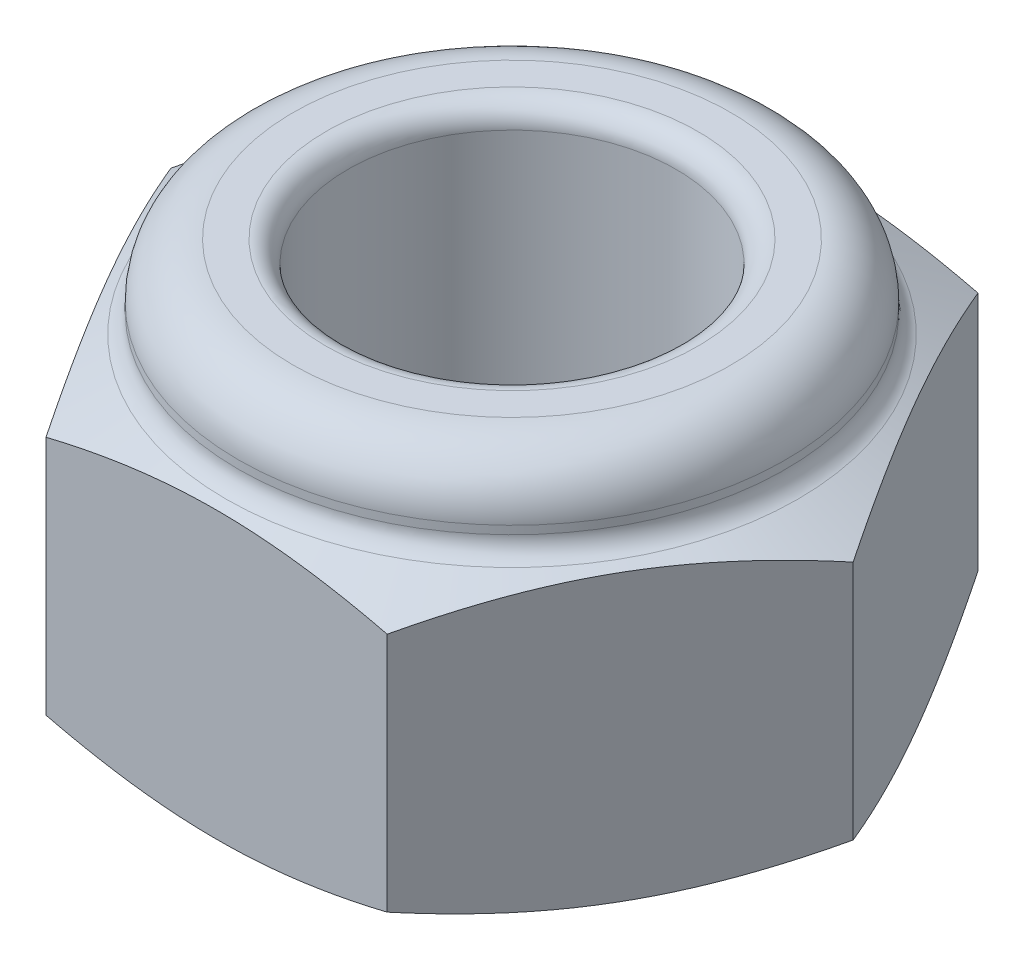
ISO-10303-21;
HEADER;
FILE_DESCRIPTION(('STEP AP214'),'2;1');
FILE_NAME('part.step','',(''),(''),'','','');
FILE_SCHEMA(('AUTOMOTIVE_DESIGN { 1 0 10303 214 1 1 1 1 }'));
ENDSEC;
DATA;
#1=APPLICATION_CONTEXT('core data for automotive mechanical design processes');
#2=APPLICATION_PROTOCOL_DEFINITION('international standard','automotive_design',2000,#1);
#3=PRODUCT_CONTEXT('',#1,'mechanical');
#4=PRODUCT('Part','Part','',(#3));
#5=PRODUCT_RELATED_PRODUCT_CATEGORY('part','',(#4));
#6=PRODUCT_DEFINITION_FORMATION('','',#4);
#7=PRODUCT_DEFINITION_CONTEXT('part definition',#1,'design');
#8=PRODUCT_DEFINITION('design','',#6,#7);
#9=PRODUCT_DEFINITION_SHAPE('','',#8);
#10=(LENGTH_UNIT() NAMED_UNIT(*) SI_UNIT(.MILLI.,.METRE.));
#11=(NAMED_UNIT(*) PLANE_ANGLE_UNIT() SI_UNIT($,.RADIAN.));
#12=(NAMED_UNIT(*) SI_UNIT($,.STERADIAN.) SOLID_ANGLE_UNIT());
#13=UNCERTAINTY_MEASURE_WITH_UNIT(LENGTH_MEASURE(1.E-05),#10,'distance_accuracy_value','');
#14=(GEOMETRIC_REPRESENTATION_CONTEXT(3) GLOBAL_UNCERTAINTY_ASSIGNED_CONTEXT((#13)) GLOBAL_UNIT_ASSIGNED_CONTEXT((#10,
#11,#12)) REPRESENTATION_CONTEXT('',''));
#15=CARTESIAN_POINT('',(0.,0.,0.));
#16=DIRECTION('',(0.,0.,1.));
#17=DIRECTION('',(1.,0.,0.));
#18=AXIS2_PLACEMENT_3D('',#15,#16,#17);
#19=CARTESIAN_POINT('',(1.55884572681199,1.4,2.7));
#20=DIRECTION('',(-0.866025403784439,0.,-0.5));
#21=DIRECTION('',(-0.5,0.,0.866025403784439));
#22=AXIS2_PLACEMENT_3D('',#19,#20,#21);
#23=PLANE('',#22);
#24=CARTESIAN_POINT('',(3.11780692367782,-1.09994391546074,-0.000200000000000864));
#25=CARTESIAN_POINT('',(3.07256028865668,-1.12192030262385,0.0781694707281279));
#26=CARTESIAN_POINT('',(3.02714131524047,-1.14254891267692,0.156837440312636));
#27=CARTESIAN_POINT('',(2.93595040530064,-1.18065333296517,0.314784729516853));
#28=CARTESIAN_POINT('',(2.8901782962198,-1.19812748468401,0.394064348014452));
#29=CARTESIAN_POINT('',(2.79826244016689,-1.22946144459945,0.553267280719281));
#30=CARTESIAN_POINT('',(2.75211829764663,-1.24331667166284,0.633191280036078));
#31=CARTESIAN_POINT('',(2.65957440015918,-1.26693209007472,0.793482012414777));
#32=CARTESIAN_POINT('',(2.61317469231809,-1.27669301238165,0.873848663851907));
#33=CARTESIAN_POINT('',(2.52120907705397,-1.29159532259173,1.03313778203869));
#34=CARTESIAN_POINT('',(2.47564711379912,-1.29683302390061,1.11205341728868));
#35=CARTESIAN_POINT('',(2.38444615418405,-1.30284150252472,1.27001811304101));
#36=CARTESIAN_POINT('',(2.3388071538454,-1.30361204161315,1.34906718043421));
#37=CARTESIAN_POINT('',(2.24761264293103,-1.30065577348523,1.5070207067093));
#38=CARTESIAN_POINT('',(2.20205709465482,-1.29693354152126,1.58592523089034));
#39=CARTESIAN_POINT('',(2.11109193389101,-1.28514782232476,1.74348151105194));
#40=CARTESIAN_POINT('',(2.06568230893312,-1.27708471654445,1.82213328863166));
#41=CARTESIAN_POINT('',(1.98169142278206,-1.25838651295584,1.96760977081801));
#42=CARTESIAN_POINT('',(1.94307921975688,-1.24829730119537,2.03448806824979));
#43=CARTESIAN_POINT('',(1.86605523389241,-1.22541324415785,2.16789752516853));
#44=CARTESIAN_POINT('',(1.82764345852041,-1.21261829880095,2.23442867172175));
#45=CARTESIAN_POINT('',(1.75066867636476,-1.18445557965474,2.36775290531687));
#46=CARTESIAN_POINT('',(1.71210788697121,-1.16906378091678,2.43454215172648));
#47=CARTESIAN_POINT('',(1.63523454688317,-1.13608244562171,2.56769068250648));
#48=CARTESIAN_POINT('',(1.59692191900575,-1.11849363067909,2.63405010056164));
#49=CARTESIAN_POINT('',(1.55873025675815,-1.09994391546075,2.7002));
#50=B_SPLINE_CURVE_WITH_KNOTS('',3,(#24,#25,#26,#27,#28,#29,#30,#31,#32,#33,#34,#35,#36,#37,#38,
#39,#40,#41,#42,#43,#44,#45,#46,#47,#48,#49),.UNSPECIFIED.,.F.,.F.,(4,2,2,2,2,2,2,2,2,2,2,2,4),
(0.,0.279385541508917,0.558917550140784,0.838801717024647,1.11863589474765,1.39235324880075,
1.66608519964082,1.93953862820556,2.2129680311007,2.44655992287335,2.68016045626954,
2.91605430501085,3.15187087666844),.UNSPECIFIED.);
#51=CARTESIAN_POINT('',(3.11769145362398,-1.1,0.));
#52=VERTEX_POINT('',#51);
#53=CARTESIAN_POINT('',(1.55884572681199,-1.1,2.7));
#54=VERTEX_POINT('',#53);
#55=EDGE_CURVE('E50',#52,#54,#50,.T.);
#56=ORIENTED_EDGE('',*,*,#55,.F.);
#57=DIRECTION('',(0.,-1.,0.));
#58=VECTOR('',#57,1.);
#59=CARTESIAN_POINT('',(3.11769145362398,1.4,0.));
#60=LINE('',#59,#58);
#61=CARTESIAN_POINT('',(3.11769145362398,1.1,0.));
#62=VERTEX_POINT('',#61);
#63=EDGE_CURVE('E104',#62,#52,#60,.T.);
#64=ORIENTED_EDGE('',*,*,#63,.F.);
#65=CARTESIAN_POINT('',(1.55873025675815,1.09994391546074,2.7002));
#66=CARTESIAN_POINT('',(1.60397689177929,1.12192030262385,2.62183052927187));
#67=CARTESIAN_POINT('',(1.6493958651955,1.14254891267692,2.54316255968736));
#68=CARTESIAN_POINT('',(1.74058677513533,1.18065333296517,2.38521527048315));
#69=CARTESIAN_POINT('',(1.78635888421617,1.19812748468401,2.30593565198555));
#70=CARTESIAN_POINT('',(1.87827474026908,1.22946144459945,2.14673271928072));
#71=CARTESIAN_POINT('',(1.92441888278934,1.24331667166284,2.06680871996392));
#72=CARTESIAN_POINT('',(2.01696278027679,1.26693209007472,1.90651798758522));
#73=CARTESIAN_POINT('',(2.06336248811788,1.27669301238165,1.82615133614809));
#74=CARTESIAN_POINT('',(2.155328103382,1.29159532259173,1.66686221796131));
#75=CARTESIAN_POINT('',(2.20089006663685,1.29683302390061,1.58794658271132));
#76=CARTESIAN_POINT('',(2.29209102625192,1.30284150252472,1.42998188695899));
#77=CARTESIAN_POINT('',(2.33773002659057,1.30361204161315,1.35093281956579));
#78=CARTESIAN_POINT('',(2.42892453750494,1.30065577348523,1.1929792932907));
#79=CARTESIAN_POINT('',(2.47448008578115,1.29693354152126,1.11407476910966));
#80=CARTESIAN_POINT('',(2.56544524654496,1.28514782232476,0.956518488948062));
#81=CARTESIAN_POINT('',(2.61085487150285,1.27708471654445,0.877866711368344));
#82=CARTESIAN_POINT('',(2.69484575765391,1.25838651295584,0.73239022918199));
#83=CARTESIAN_POINT('',(2.73345796067909,1.24829730119537,0.665511931750207));
#84=CARTESIAN_POINT('',(2.81048194654356,1.22541324415785,0.532102474831471));
#85=CARTESIAN_POINT('',(2.84889372191556,1.21261829880095,0.465571328278254));
#86=CARTESIAN_POINT('',(2.92586850407121,1.18445557965474,0.332247094683126));
#87=CARTESIAN_POINT('',(2.96442929346476,1.16906378091678,0.26545784827352));
#88=CARTESIAN_POINT('',(3.0413026335528,1.13608244562171,0.132309317493521));
#89=CARTESIAN_POINT('',(3.07961526143022,1.11849363067909,0.0659498994383551));
#90=CARTESIAN_POINT('',(3.11780692367782,1.09994391546075,-0.000200000000001502));
#91=B_SPLINE_CURVE_WITH_KNOTS('',3,(#65,#66,#67,#68,#69,#70,#71,#72,#73,#74,#75,#76,#77,#78,#79,
#80,#81,#82,#83,#84,#85,#86,#87,#88,#89,#90),.UNSPECIFIED.,.F.,.F.,(4,2,2,2,2,2,2,2,2,2,2,2,4),
(0.,0.279385541508917,0.558917550140785,0.838801717024647,1.11863589474765,1.39235324880075,
1.66608519964082,1.93953862820556,2.2129680311007,2.44655992287335,2.68016045626954,
2.91605430501085,3.15187087666844),.UNSPECIFIED.);
#92=CARTESIAN_POINT('',(1.55884572681199,1.1,2.7));
#93=VERTEX_POINT('',#92);
#94=EDGE_CURVE('E148',#93,#62,#91,.T.);
#95=ORIENTED_EDGE('',*,*,#94,.F.);
#96=DIRECTION('',(0.,-1.,0.));
#97=VECTOR('',#96,1.);
#98=CARTESIAN_POINT('',(1.55884572681199,1.4,2.7));
#99=LINE('',#98,#97);
#100=EDGE_CURVE('E233',#93,#54,#99,.T.);
#101=ORIENTED_EDGE('',*,*,#100,.T.);
#102=EDGE_LOOP('',(#56,#64,#95,#101));
#103=FACE_BOUND('',#102,.T.);
#104=ADVANCED_FACE('F35',(#103),#23,.F.);
#105=CARTESIAN_POINT('',(3.11769145362398,1.4,0.));
#106=DIRECTION('',(-0.866025403784438,0.,0.5));
#107=DIRECTION('',(0.5,0.,0.866025403784438));
#108=AXIS2_PLACEMENT_3D('',#105,#106,#107);
#109=PLANE('',#108);
#110=CARTESIAN_POINT('',(1.55873025675815,-1.09994391546074,-2.7002));
#111=CARTESIAN_POINT('',(1.60397689177928,-1.12192030262385,-2.62183052927187));
#112=CARTESIAN_POINT('',(1.6493958651955,-1.14254891267692,-2.54316255968736));
#113=CARTESIAN_POINT('',(1.74058677513533,-1.18065333296517,-2.38521527048315));
#114=CARTESIAN_POINT('',(1.78635888421617,-1.19812748468401,-2.30593565198555));
#115=CARTESIAN_POINT('',(1.87827474026908,-1.22946144459945,-2.14673271928072));
#116=CARTESIAN_POINT('',(1.92441888278934,-1.24331667166284,-2.06680871996392));
#117=CARTESIAN_POINT('',(2.01696278027679,-1.26693209007472,-1.90651798758522));
#118=CARTESIAN_POINT('',(2.06336248811788,-1.27669301238165,-1.82615133614809));
#119=CARTESIAN_POINT('',(2.155328103382,-1.29159532259173,-1.66686221796131));
#120=CARTESIAN_POINT('',(2.20089006663685,-1.29683302390061,-1.58794658271132));
#121=CARTESIAN_POINT('',(2.29209102625192,-1.30284150252473,-1.42998188695899));
#122=CARTESIAN_POINT('',(2.33773002659057,-1.30361204161315,-1.35093281956579));
#123=CARTESIAN_POINT('',(2.42892453750494,-1.30065577348523,-1.1929792932907));
#124=CARTESIAN_POINT('',(2.47448008578115,-1.29693354152126,-1.11407476910966));
#125=CARTESIAN_POINT('',(2.56544524654496,-1.28514782232476,-0.956518488948063));
#126=CARTESIAN_POINT('',(2.61085487150285,-1.27708471654445,-0.877866711368345));
#127=CARTESIAN_POINT('',(2.69484575765391,-1.25838651295584,-0.732390229181991));
#128=CARTESIAN_POINT('',(2.73345796067909,-1.24829730119537,-0.665511931750209));
#129=CARTESIAN_POINT('',(2.81048194654356,-1.22541324415785,-0.532102474831473));
#130=CARTESIAN_POINT('',(2.84889372191556,-1.21261829880095,-0.465571328278256));
#131=CARTESIAN_POINT('',(2.92586850407121,-1.18445557965474,-0.332247094683128));
#132=CARTESIAN_POINT('',(2.96442929346476,-1.16906378091678,-0.265457848273522));
#133=CARTESIAN_POINT('',(3.0413026335528,-1.13608244562171,-0.132309317493523));
#134=CARTESIAN_POINT('',(3.07961526143022,-1.11849363067909,-0.0659498994383571));
#135=CARTESIAN_POINT('',(3.11780692367782,-1.09994391546075,0.000199999999999769));
#136=B_SPLINE_CURVE_WITH_KNOTS('',3,(#110,#111,#112,#113,#114,#115,#116,#117,#118,#119,#120,
#121,#122,#123,#124,#125,#126,#127,#128,#129,#130,#131,#132,#133,#134,#135),.UNSPECIFIED.,.F.,
.F.,(4,2,2,2,2,2,2,2,2,2,2,2,4),(0.,0.279385541508917,0.558917550140784,0.838801717024647,
1.11863589474765,1.39235324880074,1.66608519964081,1.93953862820556,2.2129680311007,
2.44655992287335,2.68016045626954,2.91605430501084,3.15187087666844),.UNSPECIFIED.);
#137=CARTESIAN_POINT('',(1.55884572681199,-1.1,-2.7));
#138=VERTEX_POINT('',#137);
#139=EDGE_CURVE('E89',#138,#52,#136,.T.);
#140=ORIENTED_EDGE('',*,*,#139,.F.);
#141=DIRECTION('',(0.,-1.,0.));
#142=VECTOR('',#141,1.);
#143=CARTESIAN_POINT('',(1.55884572681199,1.4,-2.7));
#144=LINE('',#143,#142);
#145=CARTESIAN_POINT('',(1.55884572681199,1.1,-2.7));
#146=VERTEX_POINT('',#145);
#147=EDGE_CURVE('E102',#146,#138,#144,.T.);
#148=ORIENTED_EDGE('',*,*,#147,.F.);
#149=CARTESIAN_POINT('',(3.11780692367782,1.09994391546074,0.000199999999999368));
#150=CARTESIAN_POINT('',(3.07256028865668,1.12192030262385,-0.0781694707281294));
#151=CARTESIAN_POINT('',(3.02714131524047,1.14254891267692,-0.156837440312637));
#152=CARTESIAN_POINT('',(2.93595040530064,1.18065333296517,-0.314784729516854));
#153=CARTESIAN_POINT('',(2.8901782962198,1.19812748468401,-0.394064348014453));
#154=CARTESIAN_POINT('',(2.79826244016689,1.22946144459945,-0.553267280719283));
#155=CARTESIAN_POINT('',(2.75211829764663,1.24331667166284,-0.633191280036079));
#156=CARTESIAN_POINT('',(2.65957440015918,1.26693209007472,-0.793482012414778));
#157=CARTESIAN_POINT('',(2.61317469231809,1.27669301238165,-0.873848663851909));
#158=CARTESIAN_POINT('',(2.52120907705397,1.29159532259173,-1.0331377820387));
#159=CARTESIAN_POINT('',(2.47564711379911,1.29683302390061,-1.11205341728868));
#160=CARTESIAN_POINT('',(2.38444615418405,1.30284150252473,-1.27001811304101));
#161=CARTESIAN_POINT('',(2.3388071538454,1.30361204161315,-1.34906718043422));
#162=CARTESIAN_POINT('',(2.24761264293103,1.30065577348523,-1.5070207067093));
#163=CARTESIAN_POINT('',(2.20205709465482,1.29693354152126,-1.58592523089034));
#164=CARTESIAN_POINT('',(2.11109193389101,1.28514782232476,-1.74348151105194));
#165=CARTESIAN_POINT('',(2.06568230893311,1.27708471654445,-1.82213328863166));
#166=CARTESIAN_POINT('',(1.98169142278206,1.25838651295584,-1.96760977081801));
#167=CARTESIAN_POINT('',(1.94307921975688,1.24829730119537,-2.03448806824979));
#168=CARTESIAN_POINT('',(1.86605523389241,1.22541324415785,-2.16789752516853));
#169=CARTESIAN_POINT('',(1.82764345852041,1.21261829880095,-2.23442867172175));
#170=CARTESIAN_POINT('',(1.75066867636476,1.18445557965474,-2.36775290531687));
#171=CARTESIAN_POINT('',(1.71210788697121,1.16906378091678,-2.43454215172648));
#172=CARTESIAN_POINT('',(1.63523454688317,1.13608244562171,-2.56769068250648));
#173=CARTESIAN_POINT('',(1.59692191900575,1.11849363067909,-2.63405010056164));
#174=CARTESIAN_POINT('',(1.55873025675815,1.09994391546075,-2.7002));
#175=B_SPLINE_CURVE_WITH_KNOTS('',3,(#149,#150,#151,#152,#153,#154,#155,#156,#157,#158,#159,
#160,#161,#162,#163,#164,#165,#166,#167,#168,#169,#170,#171,#172,#173,#174),.UNSPECIFIED.,.F.,
.F.,(4,2,2,2,2,2,2,2,2,2,2,2,4),(0.,0.279385541508917,0.558917550140784,0.838801717024648,
1.11863589474765,1.39235324880075,1.66608519964082,1.93953862820556,2.2129680311007,
2.44655992287335,2.68016045626954,2.91605430501084,3.15187087666844),.UNSPECIFIED.);
#176=EDGE_CURVE('E223',#62,#146,#175,.T.);
#177=ORIENTED_EDGE('',*,*,#176,.F.);
#178=ORIENTED_EDGE('',*,*,#63,.T.);
#179=EDGE_LOOP('',(#140,#148,#177,#178));
#180=FACE_BOUND('',#179,.T.);
#181=ADVANCED_FACE('F100',(#180),#109,.F.);
#182=CARTESIAN_POINT('',(1.55884572681199,1.4,-2.7));
#183=DIRECTION('',(0.,0.,1.));
#184=DIRECTION('',(1.,0.,0.));
#185=AXIS2_PLACEMENT_3D('',#182,#183,#184);
#186=PLANE('',#185);
#187=CARTESIAN_POINT('',(-4.69113767948515,0.0146137083795435,-2.7));
#188=CARTESIAN_POINT('',(-4.55468747732765,-0.0428071602979565,-2.7));
#189=CARTESIAN_POINT('',(-4.41802239054629,-0.0997259467058353,-2.7));
#190=CARTESIAN_POINT('',(-4.14413431800298,-0.212248994777574,-2.7));
#191=CARTESIAN_POINT('',(-4.00691126981511,-0.267853104329405,-2.7));
#192=CARTESIAN_POINT('',(-3.73131800682273,-0.377619230758513,-2.7));
#193=CARTESIAN_POINT('',(-3.59294544377368,-0.431775371253652,-2.7));
#194=CARTESIAN_POINT('',(-3.31539674486345,-0.537980683947498,-2.7));
#195=CARTESIAN_POINT('',(-3.17622063657551,-0.590029927958033,-2.7));
#196=CARTESIAN_POINT('',(-2.89745778983694,-0.691207619077893,-2.7));
#197=CARTESIAN_POINT('',(-2.75787514043473,-0.740347271943029,-2.7));
#198=CARTESIAN_POINT('',(-2.47751012828499,-0.8351317487188,-2.7));
#199=CARTESIAN_POINT('',(-2.33672768068775,-0.880776323139671,-2.7));
#200=CARTESIAN_POINT('',(-2.05386412158284,-0.967442259910974,-2.7));
#201=CARTESIAN_POINT('',(-1.91178426862915,-1.00846767503729,-2.7));
#202=CARTESIAN_POINT('',(-1.62605040318147,-1.08452089412323,-2.7));
#203=CARTESIAN_POINT('',(-1.48239666738035,-1.11954973485076,-2.7));
#204=CARTESIAN_POINT('',(-1.14083641452659,-1.19318445404867,-2.7));
#205=CARTESIAN_POINT('',(-0.942170311485041,-1.22847087037316,-2.7));
#206=CARTESIAN_POINT('',(-0.642434964040471,-1.26706851937335,-2.7));
#207=CARTESIAN_POINT('',(-0.542272946980121,-1.27754445347769,-2.7));
#208=CARTESIAN_POINT('',(-0.341532054065742,-1.29328911490717,-2.7));
#209=CARTESIAN_POINT('',(-0.240953187924242,-1.2985579628794,-2.7));
#210=CARTESIAN_POINT('',(-0.0397183499847793,-1.30363007169235,-2.7));
#211=CARTESIAN_POINT('',(0.0609375370085431,-1.30343667399282,-2.7));
#212=CARTESIAN_POINT('',(0.26208975057184,-1.29760326538065,-2.7));
#213=CARTESIAN_POINT('',(0.362586076036933,-1.29196321691611,-2.7));
#214=CARTESIAN_POINT('',(0.563218857218127,-1.27549946871654,-2.7));
#215=CARTESIAN_POINT('',(0.663355008872786,-1.26467211314156,-2.7));
#216=CARTESIAN_POINT('',(0.86300881533064,-1.2382979795293,-2.7));
#217=CARTESIAN_POINT('',(0.962526376134903,-1.22275050130456,-2.7));
#218=CARTESIAN_POINT('',(1.21794777486023,-1.17735578612481,-2.7));
#219=CARTESIAN_POINT('',(1.373304245304,-1.14443068445732,-2.7));
#220=CARTESIAN_POINT('',(1.68210258926081,-1.07058061440098,-2.7));
#221=CARTESIAN_POINT('',(1.83554386139707,-1.02965319731164,-2.7));
#222=CARTESIAN_POINT('',(2.14099571520461,-0.941689757380214,-2.7));
#223=CARTESIAN_POINT('',(2.29300259402951,-0.894641024869303,-2.7));
#224=CARTESIAN_POINT('',(2.59551288665667,-0.796036354432129,-2.7));
#225=CARTESIAN_POINT('',(2.74601647302029,-0.744480940605079,-2.7));
#226=CARTESIAN_POINT('',(3.04789046875134,-0.637244652095412,-2.7));
#227=CARTESIAN_POINT('',(3.19924397946193,-0.581516501365703,-2.7));
#228=CARTESIAN_POINT('',(3.50095709426521,-0.467421134591493,-2.7));
#229=CARTESIAN_POINT('',(3.65131664767578,-0.409053785145371,-2.7));
#230=CARTESIAN_POINT('',(3.95029254085544,-0.290673618723429,-2.7));
#231=CARTESIAN_POINT('',(4.09891389878789,-0.230673425321061,-2.7));
#232=CARTESIAN_POINT('',(4.39548599142938,-0.109104685009477,-2.7));
#233=CARTESIAN_POINT('',(4.54343683272577,-0.0475363984628555,-2.7));
#234=CARTESIAN_POINT('',(4.69113767948515,0.0146137083795442,-2.7));
#235=B_SPLINE_CURVE_WITH_KNOTS('',3,(#187,#188,#189,#190,#191,#192,#193,#194,#195,#196,#197,
#198,#199,#200,#201,#202,#203,#204,#205,#206,#207,#208,#209,#210,#211,#212,#213,#214,#215,#216,
#217,#218,#219,#220,#221,#222,#223,#224,#225,#226,#227,#228,#229,#230,#231,#232,#233,#234),
.UNSPECIFIED.,.F.,.F.,(4,2,2,2,2,2,2,2,2,2,2,2,2,2,2,2,2,2,2,2,2,2,2,4),(0.,0.444123678734628,
0.888298494895089,1.33406370933169,1.77981371741346,2.22371728923289,2.66765251881139,
3.1111951605473,3.55466103908647,4.15914990134108,4.461160470823,4.76316404261981,
5.06498287155266,5.36680378138888,5.66883771808473,5.97091648069084,6.44703576594981,
6.92330097188916,7.40057131594465,7.87778623005908,8.36161550819059,8.84546926947997,
9.32628684560132,9.80702510173027),.UNSPECIFIED.);
#236=CARTESIAN_POINT('',(-1.55884572681199,-1.1,-2.7));
#237=VERTEX_POINT('',#236);
#238=EDGE_CURVE('E86',#237,#138,#235,.T.);
#239=ORIENTED_EDGE('',*,*,#238,.F.);
#240=DIRECTION('',(0.,-1.,0.));
#241=VECTOR('',#240,1.);
#242=CARTESIAN_POINT('',(-1.55884572681199,1.4,-2.7));
#243=LINE('',#242,#241);
#244=CARTESIAN_POINT('',(-1.55884572681199,1.1,-2.7));
#245=VERTEX_POINT('',#244);
#246=EDGE_CURVE('E109',#245,#237,#243,.T.);
#247=ORIENTED_EDGE('',*,*,#246,.F.);
#248=CARTESIAN_POINT('',(4.69113767948515,-0.0146137083795435,-2.7));
#249=CARTESIAN_POINT('',(4.55468747732765,0.0428071602979565,-2.7));
#250=CARTESIAN_POINT('',(4.41802239054629,0.0997259467058353,-2.7));
#251=CARTESIAN_POINT('',(4.14413431800298,0.212248994777574,-2.7));
#252=CARTESIAN_POINT('',(4.00691126981511,0.267853104329405,-2.7));
#253=CARTESIAN_POINT('',(3.73131800682273,0.377619230758513,-2.7));
#254=CARTESIAN_POINT('',(3.59294544377368,0.431775371253652,-2.7));
#255=CARTESIAN_POINT('',(3.31539674486345,0.537980683947498,-2.7));
#256=CARTESIAN_POINT('',(3.17622063657551,0.590029927958033,-2.7));
#257=CARTESIAN_POINT('',(2.89745778983694,0.691207619077893,-2.7));
#258=CARTESIAN_POINT('',(2.75787514043473,0.740347271943029,-2.7));
#259=CARTESIAN_POINT('',(2.47751012828499,0.8351317487188,-2.7));
#260=CARTESIAN_POINT('',(2.33672768068775,0.880776323139671,-2.7));
#261=CARTESIAN_POINT('',(2.05386412158284,0.967442259910974,-2.7));
#262=CARTESIAN_POINT('',(1.91178426862915,1.00846767503729,-2.7));
#263=CARTESIAN_POINT('',(1.62605040318147,1.08452089412323,-2.7));
#264=CARTESIAN_POINT('',(1.48239666738035,1.11954973485076,-2.7));
#265=CARTESIAN_POINT('',(1.14083641452659,1.19318445404867,-2.7));
#266=CARTESIAN_POINT('',(0.942170311485041,1.22847087037316,-2.7));
#267=CARTESIAN_POINT('',(0.642434964040471,1.26706851937335,-2.7));
#268=CARTESIAN_POINT('',(0.542272946980121,1.27754445347769,-2.7));
#269=CARTESIAN_POINT('',(0.341532054065742,1.29328911490717,-2.7));
#270=CARTESIAN_POINT('',(0.240953187924242,1.2985579628794,-2.7));
#271=CARTESIAN_POINT('',(0.0397183499847793,1.30363007169235,-2.7));
#272=CARTESIAN_POINT('',(-0.0609375370085431,1.30343667399282,-2.7));
#273=CARTESIAN_POINT('',(-0.26208975057184,1.29760326538065,-2.7));
#274=CARTESIAN_POINT('',(-0.362586076036933,1.29196321691611,-2.7));
#275=CARTESIAN_POINT('',(-0.563218857218127,1.27549946871654,-2.7));
#276=CARTESIAN_POINT('',(-0.663355008872786,1.26467211314156,-2.7));
#277=CARTESIAN_POINT('',(-0.86300881533064,1.2382979795293,-2.7));
#278=CARTESIAN_POINT('',(-0.962526376134903,1.22275050130456,-2.7));
#279=CARTESIAN_POINT('',(-1.21794777486023,1.17735578612481,-2.7));
#280=CARTESIAN_POINT('',(-1.373304245304,1.14443068445732,-2.7));
#281=CARTESIAN_POINT('',(-1.68210258926081,1.07058061440098,-2.7));
#282=CARTESIAN_POINT('',(-1.83554386139707,1.02965319731164,-2.7));
#283=CARTESIAN_POINT('',(-2.14099571520461,0.941689757380214,-2.7));
#284=CARTESIAN_POINT('',(-2.29300259402951,0.894641024869303,-2.7));
#285=CARTESIAN_POINT('',(-2.59551288665667,0.796036354432129,-2.7));
#286=CARTESIAN_POINT('',(-2.74601647302029,0.744480940605079,-2.7));
#287=CARTESIAN_POINT('',(-3.04789046875134,0.637244652095412,-2.7));
#288=CARTESIAN_POINT('',(-3.19924397946193,0.581516501365703,-2.7));
#289=CARTESIAN_POINT('',(-3.50095709426521,0.467421134591493,-2.7));
#290=CARTESIAN_POINT('',(-3.65131664767578,0.409053785145371,-2.7));
#291=CARTESIAN_POINT('',(-3.95029254085544,0.290673618723429,-2.7));
#292=CARTESIAN_POINT('',(-4.09891389878789,0.230673425321061,-2.7));
#293=CARTESIAN_POINT('',(-4.39548599142938,0.109104685009477,-2.7));
#294=CARTESIAN_POINT('',(-4.54343683272577,0.0475363984628555,-2.7));
#295=CARTESIAN_POINT('',(-4.69113767948515,-0.0146137083795442,-2.7));
#296=B_SPLINE_CURVE_WITH_KNOTS('',3,(#248,#249,#250,#251,#252,#253,#254,#255,#256,#257,#258,
#259,#260,#261,#262,#263,#264,#265,#266,#267,#268,#269,#270,#271,#272,#273,#274,#275,#276,#277,
#278,#279,#280,#281,#282,#283,#284,#285,#286,#287,#288,#289,#290,#291,#292,#293,#294,#295),
.UNSPECIFIED.,.F.,.F.,(4,2,2,2,2,2,2,2,2,2,2,2,2,2,2,2,2,2,2,2,2,2,2,4),(0.,0.444123678734628,
0.888298494895089,1.33406370933169,1.77981371741346,2.22371728923289,2.66765251881139,
3.1111951605473,3.55466103908647,4.15914990134108,4.461160470823,4.76316404261981,
5.06498287155266,5.36680378138888,5.66883771808473,5.97091648069084,6.44703576594981,
6.92330097188916,7.40057131594465,7.87778623005908,8.36161550819059,8.84546926947997,
9.32628684560132,9.80702510173027),.UNSPECIFIED.);
#297=EDGE_CURVE('E108',#146,#245,#296,.T.);
#298=ORIENTED_EDGE('',*,*,#297,.F.);
#299=ORIENTED_EDGE('',*,*,#147,.T.);
#300=EDGE_LOOP('',(#239,#247,#298,#299));
#301=FACE_BOUND('',#300,.T.);
#302=ADVANCED_FACE('F107',(#301),#186,.F.);
#303=CARTESIAN_POINT('',(-1.55884572681199,1.4,-2.7));
#304=DIRECTION('',(0.866025403784439,0.,0.5));
#305=DIRECTION('',(0.5,0.,-0.866025403784439));
#306=AXIS2_PLACEMENT_3D('',#303,#304,#305);
#307=PLANE('',#306);
#308=CARTESIAN_POINT('',(-3.11780692367782,-1.09994391546074,0.000199999999999775));
#309=CARTESIAN_POINT('',(-3.07256028865668,-1.12192030262385,-0.0781694707281291));
#310=CARTESIAN_POINT('',(-3.02714131524047,-1.14254891267692,-0.156837440312637));
#311=CARTESIAN_POINT('',(-2.93595040530064,-1.18065333296517,-0.314784729516854));
#312=CARTESIAN_POINT('',(-2.8901782962198,-1.19812748468401,-0.394064348014453));
#313=CARTESIAN_POINT('',(-2.79826244016689,-1.22946144459945,-0.553267280719282));
#314=CARTESIAN_POINT('',(-2.75211829764663,-1.24331667166284,-0.633191280036078));
#315=CARTESIAN_POINT('',(-2.65957440015918,-1.26693209007472,-0.793482012414778));
#316=CARTESIAN_POINT('',(-2.61317469231809,-1.27669301238165,-0.873848663851908));
#317=CARTESIAN_POINT('',(-2.52120907705397,-1.29159532259173,-1.03313778203869));
#318=CARTESIAN_POINT('',(-2.47564711379911,-1.29683302390061,-1.11205341728868));
#319=CARTESIAN_POINT('',(-2.38444615418405,-1.30284150252473,-1.27001811304101));
#320=CARTESIAN_POINT('',(-2.3388071538454,-1.30361204161315,-1.34906718043422));
#321=CARTESIAN_POINT('',(-2.24761264293103,-1.30065577348523,-1.5070207067093));
#322=CARTESIAN_POINT('',(-2.20205709465482,-1.29693354152126,-1.58592523089034));
#323=CARTESIAN_POINT('',(-2.11109193389101,-1.28514782232476,-1.74348151105194));
#324=CARTESIAN_POINT('',(-2.06568230893311,-1.27708471654445,-1.82213328863166));
#325=CARTESIAN_POINT('',(-1.98169142278206,-1.25838651295584,-1.96760977081801));
#326=CARTESIAN_POINT('',(-1.94307921975688,-1.24829730119537,-2.03448806824979));
#327=CARTESIAN_POINT('',(-1.86605523389241,-1.22541324415785,-2.16789752516853));
#328=CARTESIAN_POINT('',(-1.82764345852041,-1.21261829880095,-2.23442867172175));
#329=CARTESIAN_POINT('',(-1.75066867636476,-1.18445557965474,-2.36775290531687));
#330=CARTESIAN_POINT('',(-1.7121078869712,-1.16906378091678,-2.43454215172648));
#331=CARTESIAN_POINT('',(-1.63523454688317,-1.13608244562171,-2.56769068250648));
#332=CARTESIAN_POINT('',(-1.59692191900575,-1.11849363067909,-2.63405010056164));
#333=CARTESIAN_POINT('',(-1.55873025675815,-1.09994391546075,-2.7002));
#334=B_SPLINE_CURVE_WITH_KNOTS('',3,(#308,#309,#310,#311,#312,#313,#314,#315,#316,#317,#318,
#319,#320,#321,#322,#323,#324,#325,#326,#327,#328,#329,#330,#331,#332,#333),.UNSPECIFIED.,.F.,
.F.,(4,2,2,2,2,2,2,2,2,2,2,2,4),(0.,0.279385541508918,0.558917550140784,0.838801717024647,
1.11863589474765,1.39235324880075,1.66608519964082,1.93953862820556,2.2129680311007,
2.44655992287335,2.68016045626954,2.91605430501084,3.15187087666844),.UNSPECIFIED.);
#335=CARTESIAN_POINT('',(-3.11769145362398,-1.1,0.));
#336=VERTEX_POINT('',#335);
#337=EDGE_CURVE('E91',#336,#237,#334,.T.);
#338=ORIENTED_EDGE('',*,*,#337,.F.);
#339=DIRECTION('',(0.,-1.,0.));
#340=VECTOR('',#339,1.);
#341=CARTESIAN_POINT('',(-3.11769145362398,1.4,0.));
#342=LINE('',#341,#340);
#343=CARTESIAN_POINT('',(-3.11769145362398,1.1,0.));
#344=VERTEX_POINT('',#343);
#345=EDGE_CURVE('E113',#344,#336,#342,.T.);
#346=ORIENTED_EDGE('',*,*,#345,.F.);
#347=CARTESIAN_POINT('',(-1.55873025675815,1.09994391546074,-2.7002));
#348=CARTESIAN_POINT('',(-1.60397689177928,1.12192030262385,-2.62183052927187));
#349=CARTESIAN_POINT('',(-1.6493958651955,1.14254891267692,-2.54316255968736));
#350=CARTESIAN_POINT('',(-1.74058677513533,1.18065333296517,-2.38521527048315));
#351=CARTESIAN_POINT('',(-1.78635888421617,1.19812748468401,-2.30593565198555));
#352=CARTESIAN_POINT('',(-1.87827474026908,1.22946144459945,-2.14673271928072));
#353=CARTESIAN_POINT('',(-1.92441888278934,1.24331667166284,-2.06680871996392));
#354=CARTESIAN_POINT('',(-2.01696278027679,1.26693209007472,-1.90651798758522));
#355=CARTESIAN_POINT('',(-2.06336248811788,1.27669301238165,-1.82615133614809));
#356=CARTESIAN_POINT('',(-2.155328103382,1.29159532259173,-1.66686221796131));
#357=CARTESIAN_POINT('',(-2.20089006663685,1.29683302390061,-1.58794658271132));
#358=CARTESIAN_POINT('',(-2.29209102625192,1.30284150252473,-1.42998188695899));
#359=CARTESIAN_POINT('',(-2.33773002659057,1.30361204161315,-1.35093281956579));
#360=CARTESIAN_POINT('',(-2.42892453750494,1.30065577348523,-1.1929792932907));
#361=CARTESIAN_POINT('',(-2.47448008578115,1.29693354152126,-1.11407476910966));
#362=CARTESIAN_POINT('',(-2.56544524654496,1.28514782232476,-0.956518488948064));
#363=CARTESIAN_POINT('',(-2.61085487150285,1.27708471654445,-0.877866711368346));
#364=CARTESIAN_POINT('',(-2.69484575765391,1.25838651295584,-0.732390229181991));
#365=CARTESIAN_POINT('',(-2.73345796067909,1.24829730119537,-0.665511931750209));
#366=CARTESIAN_POINT('',(-2.81048194654356,1.22541324415785,-0.532102474831473));
#367=CARTESIAN_POINT('',(-2.84889372191556,1.21261829880095,-0.465571328278255));
#368=CARTESIAN_POINT('',(-2.9258685040712,1.18445557965474,-0.332247094683127));
#369=CARTESIAN_POINT('',(-2.96442929346476,1.16906378091678,-0.265457848273521));
#370=CARTESIAN_POINT('',(-3.0413026335528,1.13608244562171,-0.132309317493523));
#371=CARTESIAN_POINT('',(-3.07961526143022,1.11849363067909,-0.0659498994383563));
#372=CARTESIAN_POINT('',(-3.11780692367782,1.09994391546075,0.000200000000000746));
#373=B_SPLINE_CURVE_WITH_KNOTS('',3,(#347,#348,#349,#350,#351,#352,#353,#354,#355,#356,#357,
#358,#359,#360,#361,#362,#363,#364,#365,#366,#367,#368,#369,#370,#371,#372),.UNSPECIFIED.,.F.,
.F.,(4,2,2,2,2,2,2,2,2,2,2,2,4),(0.,0.279385541508917,0.558917550140784,0.838801717024647,
1.11863589474765,1.39235324880074,1.66608519964081,1.93953862820556,2.2129680311007,
2.44655992287335,2.68016045626954,2.91605430501084,3.15187087666845),.UNSPECIFIED.);
#374=EDGE_CURVE('E224',#245,#344,#373,.T.);
#375=ORIENTED_EDGE('',*,*,#374,.F.);
#376=ORIENTED_EDGE('',*,*,#246,.T.);
#377=EDGE_LOOP('',(#338,#346,#375,#376));
#378=FACE_BOUND('',#377,.T.);
#379=ADVANCED_FACE('F214',(#378),#307,.F.);
#380=CARTESIAN_POINT('',(-3.11769145362398,1.4,0.));
#381=DIRECTION('',(0.866025403784438,0.,-0.5));
#382=DIRECTION('',(-0.5,0.,-0.866025403784439));
#383=AXIS2_PLACEMENT_3D('',#380,#381,#382);
#384=PLANE('',#383);
#385=CARTESIAN_POINT('',(-1.55873025675815,-1.09994391546074,2.7002));
#386=CARTESIAN_POINT('',(-1.60397689177928,-1.12192030262385,2.62183052927187));
#387=CARTESIAN_POINT('',(-1.6493958651955,-1.14254891267692,2.54316255968736));
#388=CARTESIAN_POINT('',(-1.74058677513533,-1.18065333296517,2.38521527048315));
#389=CARTESIAN_POINT('',(-1.78635888421617,-1.19812748468401,2.30593565198555));
#390=CARTESIAN_POINT('',(-1.87827474026908,-1.22946144459945,2.14673271928072));
#391=CARTESIAN_POINT('',(-1.92441888278934,-1.24331667166284,2.06680871996392));
#392=CARTESIAN_POINT('',(-2.01696278027679,-1.26693209007472,1.90651798758522));
#393=CARTESIAN_POINT('',(-2.06336248811788,-1.27669301238165,1.82615133614809));
#394=CARTESIAN_POINT('',(-2.155328103382,-1.29159532259173,1.66686221796131));
#395=CARTESIAN_POINT('',(-2.20089006663685,-1.29683302390061,1.58794658271132));
#396=CARTESIAN_POINT('',(-2.29209102625191,-1.30284150252473,1.42998188695899));
#397=CARTESIAN_POINT('',(-2.33773002659057,-1.30361204161315,1.35093281956579));
#398=CARTESIAN_POINT('',(-2.42892453750494,-1.30065577348523,1.1929792932907));
#399=CARTESIAN_POINT('',(-2.47448008578115,-1.29693354152126,1.11407476910966));
#400=CARTESIAN_POINT('',(-2.56544524654496,-1.28514782232476,0.956518488948064));
#401=CARTESIAN_POINT('',(-2.61085487150285,-1.27708471654445,0.877866711368346));
#402=CARTESIAN_POINT('',(-2.6948457576539,-1.25838651295584,0.732390229181991));
#403=CARTESIAN_POINT('',(-2.73345796067909,-1.24829730119537,0.665511931750209));
#404=CARTESIAN_POINT('',(-2.81048194654356,-1.22541324415785,0.532102474831473));
#405=CARTESIAN_POINT('',(-2.84889372191556,-1.21261829880095,0.465571328278255));
#406=CARTESIAN_POINT('',(-2.9258685040712,-1.18445557965474,0.332247094683127));
#407=CARTESIAN_POINT('',(-2.96442929346476,-1.16906378091678,0.265457848273521));
#408=CARTESIAN_POINT('',(-3.0413026335528,-1.13608244562171,0.132309317493522));
#409=CARTESIAN_POINT('',(-3.07961526143022,-1.11849363067909,0.0659498994383554));
#410=CARTESIAN_POINT('',(-3.11780692367782,-1.09994391546075,-0.000200000000001266));
#411=B_SPLINE_CURVE_WITH_KNOTS('',3,(#385,#386,#387,#388,#389,#390,#391,#392,#393,#394,#395,
#396,#397,#398,#399,#400,#401,#402,#403,#404,#405,#406,#407,#408,#409,#410),.UNSPECIFIED.,.F.,
.F.,(4,2,2,2,2,2,2,2,2,2,2,2,4),(0.,0.279385541508917,0.558917550140784,0.838801717024646,
1.11863589474765,1.39235324880074,1.66608519964081,1.93953862820556,2.2129680311007,
2.44655992287334,2.68016045626954,2.91605430501084,3.15187087666845),.UNSPECIFIED.);
#412=CARTESIAN_POINT('',(-1.55884572681199,-1.1,2.7));
#413=VERTEX_POINT('',#412);
#414=EDGE_CURVE('E195',#413,#336,#411,.T.);
#415=ORIENTED_EDGE('',*,*,#414,.F.);
#416=DIRECTION('',(0.,-1.,0.));
#417=VECTOR('',#416,1.);
#418=CARTESIAN_POINT('',(-1.55884572681199,1.4,2.7));
#419=LINE('',#418,#417);
#420=CARTESIAN_POINT('',(-1.55884572681199,1.1,2.7));
#421=VERTEX_POINT('',#420);
#422=EDGE_CURVE('E236',#421,#413,#419,.T.);
#423=ORIENTED_EDGE('',*,*,#422,.F.);
#424=CARTESIAN_POINT('',(-3.11780692367782,1.09994391546074,-0.000200000000000454));
#425=CARTESIAN_POINT('',(-3.07256028865668,1.12192030262385,0.0781694707281284));
#426=CARTESIAN_POINT('',(-3.02714131524047,1.14254891267692,0.156837440312636));
#427=CARTESIAN_POINT('',(-2.93595040530064,1.18065333296517,0.314784729516853));
#428=CARTESIAN_POINT('',(-2.8901782962198,1.19812748468401,0.394064348014452));
#429=CARTESIAN_POINT('',(-2.79826244016689,1.22946144459945,0.553267280719282));
#430=CARTESIAN_POINT('',(-2.75211829764663,1.24331667166284,0.633191280036078));
#431=CARTESIAN_POINT('',(-2.65957440015918,1.26693209007472,0.793482012414777));
#432=CARTESIAN_POINT('',(-2.61317469231808,1.27669301238165,0.873848663851907));
#433=CARTESIAN_POINT('',(-2.52120907705397,1.29159532259173,1.03313778203869));
#434=CARTESIAN_POINT('',(-2.47564711379911,1.29683302390061,1.11205341728868));
#435=CARTESIAN_POINT('',(-2.38444615418405,1.30284150252473,1.27001811304101));
#436=CARTESIAN_POINT('',(-2.3388071538454,1.30361204161315,1.34906718043421));
#437=CARTESIAN_POINT('',(-2.24761264293102,1.30065577348523,1.5070207067093));
#438=CARTESIAN_POINT('',(-2.20205709465482,1.29693354152126,1.58592523089034));
#439=CARTESIAN_POINT('',(-2.11109193389101,1.28514782232476,1.74348151105194));
#440=CARTESIAN_POINT('',(-2.06568230893311,1.27708471654445,1.82213328863166));
#441=CARTESIAN_POINT('',(-1.98169142278206,1.25838651295584,1.96760977081801));
#442=CARTESIAN_POINT('',(-1.94307921975688,1.24829730119537,2.03448806824979));
#443=CARTESIAN_POINT('',(-1.86605523389241,1.22541324415785,2.16789752516853));
#444=CARTESIAN_POINT('',(-1.82764345852041,1.21261829880095,2.23442867172175));
#445=CARTESIAN_POINT('',(-1.75066867636476,1.18445557965474,2.36775290531687));
#446=CARTESIAN_POINT('',(-1.7121078869712,1.16906378091678,2.43454215172648));
#447=CARTESIAN_POINT('',(-1.63523454688317,1.13608244562171,2.56769068250648));
#448=CARTESIAN_POINT('',(-1.59692191900575,1.11849363067909,2.63405010056164));
#449=CARTESIAN_POINT('',(-1.55873025675815,1.09994391546075,2.7002));
#450=B_SPLINE_CURVE_WITH_KNOTS('',3,(#424,#425,#426,#427,#428,#429,#430,#431,#432,#433,#434,
#435,#436,#437,#438,#439,#440,#441,#442,#443,#444,#445,#446,#447,#448,#449),.UNSPECIFIED.,.F.,
.F.,(4,2,2,2,2,2,2,2,2,2,2,2,4),(0.,0.279385541508917,0.558917550140784,0.838801717024647,
1.11863589474765,1.39235324880075,1.66608519964082,1.93953862820556,2.2129680311007,
2.44655992287335,2.68016045626954,2.91605430501084,3.15187087666844),.UNSPECIFIED.);
#451=EDGE_CURVE('E58',#344,#421,#450,.T.);
#452=ORIENTED_EDGE('',*,*,#451,.F.);
#453=ORIENTED_EDGE('',*,*,#345,.T.);
#454=EDGE_LOOP('',(#415,#423,#452,#453));
#455=FACE_BOUND('',#454,.T.);
#456=ADVANCED_FACE('F244',(#455),#384,.F.);
#457=CARTESIAN_POINT('',(-1.55884572681199,1.4,2.7));
#458=DIRECTION('',(0.,0.,-1.));
#459=DIRECTION('',(-1.,0.,0.));
#460=AXIS2_PLACEMENT_3D('',#457,#458,#459);
#461=PLANE('',#460);
#462=CARTESIAN_POINT('',(4.69113767948515,0.0146137083795446,2.7));
#463=CARTESIAN_POINT('',(4.55468747732765,-0.0428071602979555,2.7));
#464=CARTESIAN_POINT('',(4.4180223905463,-0.0997259467058344,2.7));
#465=CARTESIAN_POINT('',(4.14413431800298,-0.212248994777574,2.7));
#466=CARTESIAN_POINT('',(4.00691126981511,-0.267853104329405,2.7));
#467=CARTESIAN_POINT('',(3.73131800682273,-0.377619230758513,2.7));
#468=CARTESIAN_POINT('',(3.59294544377368,-0.431775371253652,2.7));
#469=CARTESIAN_POINT('',(3.31539674486345,-0.537980683947498,2.7));
#470=CARTESIAN_POINT('',(3.17622063657551,-0.590029927958033,2.7));
#471=CARTESIAN_POINT('',(2.89745778983694,-0.691207619077892,2.7));
#472=CARTESIAN_POINT('',(2.75787514043472,-0.740347271943029,2.7));
#473=CARTESIAN_POINT('',(2.47751012828499,-0.8351317487188,2.7));
#474=CARTESIAN_POINT('',(2.33672768068775,-0.880776323139671,2.7));
#475=CARTESIAN_POINT('',(2.05386412158284,-0.967442259910973,2.7));
#476=CARTESIAN_POINT('',(1.91178426862915,-1.00846767503729,2.7));
#477=CARTESIAN_POINT('',(1.62605040318147,-1.08452089412323,2.7));
#478=CARTESIAN_POINT('',(1.48239666738035,-1.11954973485076,2.7));
#479=CARTESIAN_POINT('',(1.14083641452659,-1.19318445404867,2.7));
#480=CARTESIAN_POINT('',(0.942170311485041,-1.22847087037316,2.7));
#481=CARTESIAN_POINT('',(0.642434964040471,-1.26706851937335,2.7));
#482=CARTESIAN_POINT('',(0.542272946980121,-1.27754445347769,2.7));
#483=CARTESIAN_POINT('',(0.341532054065742,-1.29328911490717,2.7));
#484=CARTESIAN_POINT('',(0.240953187924243,-1.2985579628794,2.7));
#485=CARTESIAN_POINT('',(0.0397183499847797,-1.30363007169235,2.7));
#486=CARTESIAN_POINT('',(-0.0609375370085429,-1.30343667399282,2.7));
#487=CARTESIAN_POINT('',(-0.26208975057184,-1.29760326538065,2.7));
#488=CARTESIAN_POINT('',(-0.362586076036932,-1.29196321691611,2.7));
#489=CARTESIAN_POINT('',(-0.563218857218126,-1.27549946871654,2.7));
#490=CARTESIAN_POINT('',(-0.663355008872786,-1.26467211314156,2.7));
#491=CARTESIAN_POINT('',(-0.86300881533064,-1.2382979795293,2.7));
#492=CARTESIAN_POINT('',(-0.962526376134903,-1.22275050130456,2.7));
#493=CARTESIAN_POINT('',(-1.21794777486023,-1.17735578612481,2.7));
#494=CARTESIAN_POINT('',(-1.373304245304,-1.14443068445732,2.7));
#495=CARTESIAN_POINT('',(-1.68210258926081,-1.07058061440098,2.7));
#496=CARTESIAN_POINT('',(-1.83554386139707,-1.02965319731164,2.7));
#497=CARTESIAN_POINT('',(-2.14099571520461,-0.941689757380214,2.7));
#498=CARTESIAN_POINT('',(-2.29300259402951,-0.894641024869302,2.7));
#499=CARTESIAN_POINT('',(-2.59551288665667,-0.796036354432128,2.7));
#500=CARTESIAN_POINT('',(-2.74601647302029,-0.744480940605078,2.7));
#501=CARTESIAN_POINT('',(-3.04789046875134,-0.637244652095412,2.7));
#502=CARTESIAN_POINT('',(-3.19924397946193,-0.581516501365702,2.7));
#503=CARTESIAN_POINT('',(-3.50095709426521,-0.467421134591493,2.7));
#504=CARTESIAN_POINT('',(-3.65131664767578,-0.409053785145371,2.7));
#505=CARTESIAN_POINT('',(-3.95029254085544,-0.290673618723429,2.7));
#506=CARTESIAN_POINT('',(-4.09891389878789,-0.230673425321061,2.7));
#507=CARTESIAN_POINT('',(-4.39548599142938,-0.109104685009477,2.7));
#508=CARTESIAN_POINT('',(-4.54343683272577,-0.0475363984628558,2.7));
#509=CARTESIAN_POINT('',(-4.69113767948515,0.0146137083795438,2.7));
#510=B_SPLINE_CURVE_WITH_KNOTS('',3,(#462,#463,#464,#465,#466,#467,#468,#469,#470,#471,#472,
#473,#474,#475,#476,#477,#478,#479,#480,#481,#482,#483,#484,#485,#486,#487,#488,#489,#490,#491,
#492,#493,#494,#495,#496,#497,#498,#499,#500,#501,#502,#503,#504,#505,#506,#507,#508,#509),
.UNSPECIFIED.,.F.,.F.,(4,2,2,2,2,2,2,2,2,2,2,2,2,2,2,2,2,2,2,2,2,2,2,4),(0.,0.444123678734628,
0.88829849489509,1.33406370933169,1.77981371741346,2.22371728923289,2.66765251881139,
3.1111951605473,3.55466103908648,4.15914990134109,4.46116047082301,4.76316404261981,
5.06498287155267,5.36680378138888,5.66883771808473,5.97091648069085,6.44703576594981,
6.92330097188917,7.40057131594466,7.87778623005908,8.36161550819059,8.84546926947997,
9.32628684560132,9.80702510173027),.UNSPECIFIED.);
#511=EDGE_CURVE('E186',#54,#413,#510,.T.);
#512=ORIENTED_EDGE('',*,*,#511,.F.);
#513=ORIENTED_EDGE('',*,*,#100,.F.);
#514=CARTESIAN_POINT('',(-4.69113767948515,-0.0146137083795435,2.7));
#515=CARTESIAN_POINT('',(-4.55468747732765,0.0428071602979569,2.7));
#516=CARTESIAN_POINT('',(-4.41802239054629,0.0997259467058359,2.7));
#517=CARTESIAN_POINT('',(-4.14413431800298,0.212248994777575,2.7));
#518=CARTESIAN_POINT('',(-4.00691126981511,0.267853104329406,2.7));
#519=CARTESIAN_POINT('',(-3.73131800682273,0.377619230758514,2.7));
#520=CARTESIAN_POINT('',(-3.59294544377368,0.431775371253653,2.7));
#521=CARTESIAN_POINT('',(-3.31539674486345,0.537980683947498,2.7));
#522=CARTESIAN_POINT('',(-3.17622063657551,0.590029927958033,2.7));
#523=CARTESIAN_POINT('',(-2.89745778983694,0.691207619077893,2.7));
#524=CARTESIAN_POINT('',(-2.75787514043473,0.740347271943029,2.7));
#525=CARTESIAN_POINT('',(-2.47751012828499,0.8351317487188,2.7));
#526=CARTESIAN_POINT('',(-2.33672768068775,0.880776323139671,2.7));
#527=CARTESIAN_POINT('',(-2.05386412158285,0.967442259910973,2.7));
#528=CARTESIAN_POINT('',(-1.91178426862915,1.00846767503729,2.7));
#529=CARTESIAN_POINT('',(-1.62605040318147,1.08452089412323,2.7));
#530=CARTESIAN_POINT('',(-1.48239666738035,1.11954973485076,2.7));
#531=CARTESIAN_POINT('',(-1.14083641452659,1.19318445404867,2.7));
#532=CARTESIAN_POINT('',(-0.942170311485043,1.22847087037316,2.7));
#533=CARTESIAN_POINT('',(-0.642434964040473,1.26706851937335,2.7));
#534=CARTESIAN_POINT('',(-0.542272946980124,1.27754445347769,2.7));
#535=CARTESIAN_POINT('',(-0.341532054065745,1.29328911490717,2.7));
#536=CARTESIAN_POINT('',(-0.240953187924246,1.2985579628794,2.7));
#537=CARTESIAN_POINT('',(-0.0397183499847826,1.30363007169235,2.7));
#538=CARTESIAN_POINT('',(0.0609375370085397,1.30343667399282,2.7));
#539=CARTESIAN_POINT('',(0.262089750571836,1.29760326538065,2.7));
#540=CARTESIAN_POINT('',(0.362586076036929,1.29196321691611,2.7));
#541=CARTESIAN_POINT('',(0.563218857218122,1.27549946871654,2.7));
#542=CARTESIAN_POINT('',(0.663355008872782,1.26467211314156,2.7));
#543=CARTESIAN_POINT('',(0.863008815330636,1.2382979795293,2.7));
#544=CARTESIAN_POINT('',(0.962526376134899,1.22275050130457,2.7));
#545=CARTESIAN_POINT('',(1.21794777486023,1.17735578612481,2.7));
#546=CARTESIAN_POINT('',(1.37330424530399,1.14443068445732,2.7));
#547=CARTESIAN_POINT('',(1.68210258926081,1.07058061440098,2.7));
#548=CARTESIAN_POINT('',(1.83554386139707,1.02965319731164,2.7));
#549=CARTESIAN_POINT('',(2.14099571520461,0.941689757380214,2.7));
#550=CARTESIAN_POINT('',(2.29300259402951,0.894641024869303,2.7));
#551=CARTESIAN_POINT('',(2.59551288665667,0.796036354432129,2.7));
#552=CARTESIAN_POINT('',(2.74601647302029,0.744480940605079,2.7));
#553=CARTESIAN_POINT('',(3.04789046875133,0.637244652095412,2.7));
#554=CARTESIAN_POINT('',(3.19924397946193,0.581516501365702,2.7));
#555=CARTESIAN_POINT('',(3.50095709426521,0.467421134591493,2.7));
#556=CARTESIAN_POINT('',(3.65131664767578,0.409053785145371,2.7));
#557=CARTESIAN_POINT('',(3.95029254085544,0.290673618723429,2.7));
#558=CARTESIAN_POINT('',(4.09891389878789,0.230673425321061,2.7));
#559=CARTESIAN_POINT('',(4.39548599142938,0.109104685009477,2.7));
#560=CARTESIAN_POINT('',(4.54343683272577,0.0475363984628553,2.7));
#561=CARTESIAN_POINT('',(4.69113767948515,-0.0146137083795446,2.7));
#562=B_SPLINE_CURVE_WITH_KNOTS('',3,(#514,#515,#516,#517,#518,#519,#520,#521,#522,#523,#524,
#525,#526,#527,#528,#529,#530,#531,#532,#533,#534,#535,#536,#537,#538,#539,#540,#541,#542,#543,
#544,#545,#546,#547,#548,#549,#550,#551,#552,#553,#554,#555,#556,#557,#558,#559,#560,#561),
.UNSPECIFIED.,.F.,.F.,(4,2,2,2,2,2,2,2,2,2,2,2,2,2,2,2,2,2,2,2,2,2,2,4),(0.,0.444123678734629,
0.88829849489509,1.33406370933169,1.77981371741346,2.22371728923289,2.66765251881139,
3.1111951605473,3.55466103908647,4.15914990134108,4.461160470823,4.7631640426198,
5.06498287155266,5.36680378138887,5.66883771808472,5.97091648069084,6.44703576594981,
6.92330097188916,7.40057131594465,7.87778623005908,8.36161550819059,8.84546926947997,
9.32628684560132,9.80702510173027),.UNSPECIFIED.);
#563=EDGE_CURVE('E163',#421,#93,#562,.T.);
#564=ORIENTED_EDGE('',*,*,#563,.F.);
#565=ORIENTED_EDGE('',*,*,#422,.T.);
#566=EDGE_LOOP('',(#512,#513,#564,#565));
#567=FACE_BOUND('',#566,.T.);
#568=ADVANCED_FACE('F289',(#567),#461,.F.);
#569=CARTESIAN_POINT('',(0.,1.1,0.));
#570=DIRECTION('',(0.,-1.,0.));
#571=DIRECTION('',(0.,0.,-1.));
#572=AXIS2_PLACEMENT_3D('',#569,#570,#571);
#573=CONICAL_SURFACE('',#572,3.11769145362398,1.11867071054877);
#574=CARTESIAN_POINT('',(0.,1.34530070555356,0.));
#575=DIRECTION('',(0.,-1.,0.));
#576=DIRECTION('',(0.,0.,-1.));
#577=AXIS2_PLACEMENT_3D('',#574,#575,#576);
#578=CIRCLE('',#577,2.6126242889961);
#579=CARTESIAN_POINT('',(0.,1.34530070555356,-2.6126242889961));
#580=VERTEX_POINT('',#579);
#581=EDGE_CURVE('E119',#580,#580,#578,.T.);
#582=ORIENTED_EDGE('',*,*,#581,.T.);
#583=EDGE_LOOP('',(#582));
#584=FACE_BOUND('',#583,.T.);
#585=ORIENTED_EDGE('',*,*,#94,.T.);
#586=ORIENTED_EDGE('',*,*,#176,.T.);
#587=ORIENTED_EDGE('',*,*,#297,.T.);
#588=ORIENTED_EDGE('',*,*,#374,.T.);
#589=ORIENTED_EDGE('',*,*,#451,.T.);
#590=ORIENTED_EDGE('',*,*,#563,.T.);
#591=EDGE_LOOP('',(#585,#586,#587,#588,#589,#590));
#592=FACE_BOUND('',#591,.T.);
#593=ADVANCED_FACE('F178',(#584,#592),#573,.T.);
#594=CARTESIAN_POINT('',(0.,-1.1,0.));
#595=DIRECTION('',(0.,1.,0.));
#596=DIRECTION('',(0.,0.,-1.));
#597=AXIS2_PLACEMENT_3D('',#594,#595,#596);
#598=CONICAL_SURFACE('',#597,3.11769145362398,1.11867071054877);
#599=CARTESIAN_POINT('',(0.,-1.4,0.));
#600=DIRECTION('',(0.,-1.,0.));
#601=DIRECTION('',(0.,0.,-1.));
#602=AXIS2_PLACEMENT_3D('',#599,#600,#601);
#603=CIRCLE('',#602,2.5);
#604=CARTESIAN_POINT('',(0.,-1.4,-2.5));
#605=VERTEX_POINT('',#604);
#606=EDGE_CURVE('E248',#605,#605,#603,.T.);
#607=ORIENTED_EDGE('',*,*,#606,.F.);
#608=EDGE_LOOP('',(#607));
#609=FACE_BOUND('',#608,.T.);
#610=ORIENTED_EDGE('',*,*,#55,.T.);
#611=ORIENTED_EDGE('',*,*,#511,.T.);
#612=ORIENTED_EDGE('',*,*,#414,.T.);
#613=ORIENTED_EDGE('',*,*,#337,.T.);
#614=ORIENTED_EDGE('',*,*,#238,.T.);
#615=ORIENTED_EDGE('',*,*,#139,.T.);
#616=EDGE_LOOP('',(#610,#611,#612,#613,#614,#615));
#617=FACE_BOUND('',#616,.T.);
#618=ADVANCED_FACE('F88',(#609,#617),#598,.T.);
#619=CARTESIAN_POINT('',(0.,-1.4,0.));
#620=DIRECTION('',(0.,1.,0.));
#621=DIRECTION('',(0.,0.,1.));
#622=AXIS2_PLACEMENT_3D('',#619,#620,#621);
#623=PLANE('',#622);
#624=CARTESIAN_POINT('',(0.,-1.4,0.));
#625=DIRECTION('',(0.,1.,0.));
#626=DIRECTION('',(0.,0.,1.));
#627=AXIS2_PLACEMENT_3D('',#624,#625,#626);
#628=CIRCLE('',#627,1.5);
#629=CARTESIAN_POINT('',(0.,-1.4,1.5));
#630=VERTEX_POINT('',#629);
#631=EDGE_CURVE('E250',#630,#630,#628,.T.);
#632=ORIENTED_EDGE('',*,*,#631,.T.);
#633=EDGE_LOOP('',(#632));
#634=FACE_BOUND('',#633,.T.);
#635=ORIENTED_EDGE('',*,*,#606,.T.);
#636=EDGE_LOOP('',(#635));
#637=FACE_BOUND('',#636,.T.);
#638=ADVANCED_FACE('F177',(#634,#637),#623,.F.);
#639=CARTESIAN_POINT('',(0.,-1.4,0.));
#640=DIRECTION('',(0.,1.,0.));
#641=DIRECTION('',(0.,0.,1.));
#642=AXIS2_PLACEMENT_3D('',#639,#640,#641);
#643=CYLINDRICAL_SURFACE('',#642,1.5);
#644=CARTESIAN_POINT('',(0.,1.9,0.));
#645=DIRECTION('',(0.,1.,0.));
#646=DIRECTION('',(0.,0.,1.));
#647=AXIS2_PLACEMENT_3D('',#644,#645,#646);
#648=CIRCLE('',#647,1.5);
#649=CARTESIAN_POINT('',(0.,1.9,1.5));
#650=VERTEX_POINT('',#649);
#651=EDGE_CURVE('E43',#650,#650,#648,.T.);
#652=ORIENTED_EDGE('',*,*,#651,.T.);
#653=EDGE_LOOP('',(#652));
#654=FACE_BOUND('',#653,.T.);
#655=ORIENTED_EDGE('',*,*,#631,.F.);
#656=EDGE_LOOP('',(#655));
#657=FACE_BOUND('',#656,.T.);
#658=ADVANCED_FACE('F124',(#654,#657),#643,.F.);
#659=CARTESIAN_POINT('',(0.,1.4,0.));
#660=DIRECTION('',(0.,1.,0.));
#661=DIRECTION('',(0.,0.,1.));
#662=AXIS2_PLACEMENT_3D('',#659,#660,#661);
#663=CYLINDRICAL_SURFACE('',#662,2.5);
#664=CARTESIAN_POINT('',(0.,1.52520480535832,0.));
#665=DIRECTION('',(0.,1.,0.));
#666=DIRECTION('',(0.,0.,1.));
#667=AXIS2_PLACEMENT_3D('',#664,#665,#666);
#668=CIRCLE('',#667,2.5);
#669=CARTESIAN_POINT('',(0.,1.52520480535832,2.5));
#670=VERTEX_POINT('',#669);
#671=EDGE_CURVE('E111',#670,#670,#668,.T.);
#672=ORIENTED_EDGE('',*,*,#671,.T.);
#673=EDGE_LOOP('',(#672));
#674=FACE_BOUND('',#673,.T.);
#675=CARTESIAN_POINT('',(0.,1.6,0.));
#676=DIRECTION('',(0.,1.,0.));
#677=DIRECTION('',(0.,0.,1.));
#678=AXIS2_PLACEMENT_3D('',#675,#676,#677);
#679=CIRCLE('',#678,2.5);
#680=CARTESIAN_POINT('',(0.,1.6,2.5));
#681=VERTEX_POINT('',#680);
#682=EDGE_CURVE('E254',#681,#681,#679,.T.);
#683=ORIENTED_EDGE('',*,*,#682,.F.);
#684=EDGE_LOOP('',(#683));
#685=FACE_BOUND('',#684,.T.);
#686=ADVANCED_FACE('F266',(#674,#685),#663,.T.);
#687=CARTESIAN_POINT('',(0.,1.6,0.));
#688=DIRECTION('',(0.,1.,0.));
#689=DIRECTION('',(0.,0.,1.));
#690=AXIS2_PLACEMENT_3D('',#687,#688,#689);
#691=TOROIDAL_SURFACE('',#690,2.,0.5);
#692=ORIENTED_EDGE('',*,*,#682,.T.);
#693=EDGE_LOOP('',(#692));
#694=FACE_BOUND('',#693,.T.);
#695=CARTESIAN_POINT('',(0.,2.1,0.));
#696=DIRECTION('',(0.,1.,0.));
#697=DIRECTION('',(0.,0.,1.));
#698=AXIS2_PLACEMENT_3D('',#695,#696,#697);
#699=CIRCLE('',#698,2.);
#700=CARTESIAN_POINT('',(0.,2.1,2.));
#701=VERTEX_POINT('',#700);
#702=EDGE_CURVE('E259',#701,#701,#699,.T.);
#703=ORIENTED_EDGE('',*,*,#702,.F.);
#704=EDGE_LOOP('',(#703));
#705=FACE_BOUND('',#704,.T.);
#706=ADVANCED_FACE('F264',(#694,#705),#691,.T.);
#707=CARTESIAN_POINT('',(0.,2.1,2.));
#708=DIRECTION('',(0.,1.,0.));
#709=DIRECTION('',(0.,0.,1.));
#710=AXIS2_PLACEMENT_3D('',#707,#708,#709);
#711=PLANE('',#710);
#712=CARTESIAN_POINT('',(0.,2.1,0.));
#713=DIRECTION('',(0.,1.,0.));
#714=DIRECTION('',(0.,0.,1.));
#715=AXIS2_PLACEMENT_3D('',#712,#713,#714);
#716=CIRCLE('',#715,1.7);
#717=CARTESIAN_POINT('',(0.,2.1,1.7));
#718=VERTEX_POINT('',#717);
#719=EDGE_CURVE('E11',#718,#718,#716,.F.);
#720=ORIENTED_EDGE('',*,*,#719,.T.);
#721=EDGE_LOOP('',(#720));
#722=FACE_BOUND('',#721,.T.);
#723=ORIENTED_EDGE('',*,*,#702,.T.);
#724=EDGE_LOOP('',(#723));
#725=FACE_BOUND('',#724,.T.);
#726=ADVANCED_FACE('F133',(#722,#725),#711,.T.);
#727=CARTESIAN_POINT('',(0.,1.52520480535832,0.));
#728=DIRECTION('',(0.,1.,0.));
#729=DIRECTION('',(0.,0.,1.));
#730=AXIS2_PLACEMENT_3D('',#727,#728,#729);
#731=TOROIDAL_SURFACE('',#730,2.7,0.2);
#732=ORIENTED_EDGE('',*,*,#581,.F.);
#733=EDGE_LOOP('',(#732));
#734=FACE_BOUND('',#733,.T.);
#735=ORIENTED_EDGE('',*,*,#671,.F.);
#736=EDGE_LOOP('',(#735));
#737=FACE_BOUND('',#736,.T.);
#738=ADVANCED_FACE('F128',(#734,#737),#731,.F.);
#739=CARTESIAN_POINT('',(0.,1.9,0.));
#740=DIRECTION('',(0.,1.,0.));
#741=DIRECTION('',(0.,0.,1.));
#742=AXIS2_PLACEMENT_3D('',#739,#740,#741);
#743=TOROIDAL_SURFACE('',#742,1.7,0.2);
#744=ORIENTED_EDGE('',*,*,#719,.F.);
#745=EDGE_LOOP('',(#744));
#746=FACE_BOUND('',#745,.T.);
#747=ORIENTED_EDGE('',*,*,#651,.F.);
#748=EDGE_LOOP('',(#747));
#749=FACE_BOUND('',#748,.T.);
#750=ADVANCED_FACE('F37',(#746,#749),#743,.T.);
#751=CLOSED_SHELL('',(#104,#181,#302,#379,#456,#568,#593,#618,#638,#658,#686,#706,#726,#738,#750));
#752=MANIFOLD_SOLID_BREP('B2',#751);
#753=ADVANCED_BREP_SHAPE_REPRESENTATION('',(#18,#752),#14);
#754=SHAPE_DEFINITION_REPRESENTATION(#9,#753);
ENDSEC;
END-ISO-10303-21;
